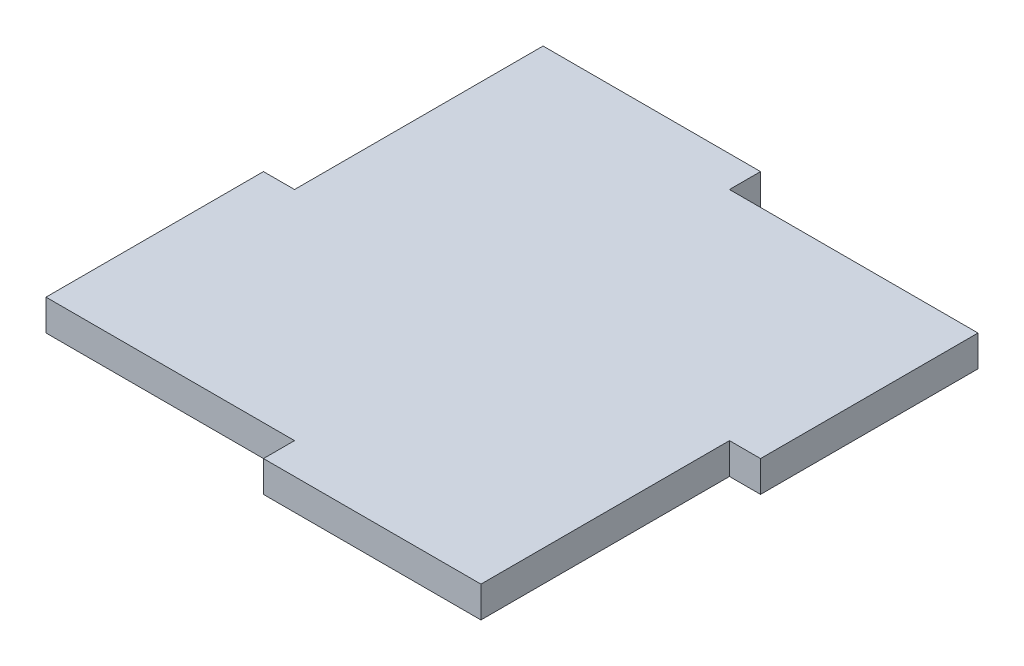
ISO-10303-21;
HEADER;
FILE_DESCRIPTION(('STEP AP214'),'2;1');
FILE_NAME('part.step','',(''),(''),'','','');
FILE_SCHEMA(('AUTOMOTIVE_DESIGN { 1 0 10303 214 1 1 1 1 }'));
ENDSEC;
DATA;
#1=APPLICATION_CONTEXT('core data for automotive mechanical design processes');
#2=APPLICATION_PROTOCOL_DEFINITION('international standard','automotive_design',2000,#1);
#3=PRODUCT_CONTEXT('',#1,'mechanical');
#4=PRODUCT('Part','Part','',(#3));
#5=PRODUCT_RELATED_PRODUCT_CATEGORY('part','',(#4));
#6=PRODUCT_DEFINITION_FORMATION('','',#4);
#7=PRODUCT_DEFINITION_CONTEXT('part definition',#1,'design');
#8=PRODUCT_DEFINITION('design','',#6,#7);
#9=PRODUCT_DEFINITION_SHAPE('','',#8);
#10=(LENGTH_UNIT() NAMED_UNIT(*) SI_UNIT(.MILLI.,.METRE.));
#11=(NAMED_UNIT(*) PLANE_ANGLE_UNIT() SI_UNIT($,.RADIAN.));
#12=(NAMED_UNIT(*) SI_UNIT($,.STERADIAN.) SOLID_ANGLE_UNIT());
#13=UNCERTAINTY_MEASURE_WITH_UNIT(LENGTH_MEASURE(1.E-05),#10,'distance_accuracy_value','');
#14=(GEOMETRIC_REPRESENTATION_CONTEXT(3) GLOBAL_UNCERTAINTY_ASSIGNED_CONTEXT((#13)) GLOBAL_UNIT_ASSIGNED_CONTEXT((#10,
#11,#12)) REPRESENTATION_CONTEXT('',''));
#15=CARTESIAN_POINT('',(0.,0.,0.));
#16=DIRECTION('',(0.,0.,1.));
#17=DIRECTION('',(1.,0.,0.));
#18=AXIS2_PLACEMENT_3D('',#15,#16,#17);
#19=CARTESIAN_POINT('',(0.,12.7,-4.41271186440678));
#20=DIRECTION('',(0.,0.,-1.));
#21=DIRECTION('',(-1.,0.,0.));
#22=AXIS2_PLACEMENT_3D('',#19,#20,#21);
#23=PLANE('',#22);
#24=DIRECTION('',(1.,0.,0.));
#25=VECTOR('',#24,1.);
#26=CARTESIAN_POINT('',(0.,0.,-4.41271186440678));
#27=LINE('',#26,#25);
#28=CARTESIAN_POINT('',(-125.206214689266,0.,-4.41271186440677));
#29=VERTEX_POINT('',#28);
#30=CARTESIAN_POINT('',(-112.506214689266,0.,-4.41271186440677));
#31=VERTEX_POINT('',#30);
#32=EDGE_CURVE('E154',#29,#31,#27,.T.);
#33=ORIENTED_EDGE('',*,*,#32,.F.);
#34=DIRECTION('',(0.,-1.,0.));
#35=VECTOR('',#34,1.);
#36=CARTESIAN_POINT('',(-125.206214689266,12.7,-4.41271186440677));
#37=LINE('',#36,#35);
#38=CARTESIAN_POINT('',(-125.206214689266,12.7,-4.41271186440677));
#39=VERTEX_POINT('',#38);
#40=EDGE_CURVE('E11',#39,#29,#37,.T.);
#41=ORIENTED_EDGE('',*,*,#40,.F.);
#42=DIRECTION('',(1.,0.,0.));
#43=VECTOR('',#42,1.);
#44=CARTESIAN_POINT('',(0.,12.7,-4.41271186440678));
#45=LINE('',#44,#43);
#46=CARTESIAN_POINT('',(-112.506214689266,12.7,-4.41271186440677));
#47=VERTEX_POINT('',#46);
#48=EDGE_CURVE('E186',#39,#47,#45,.T.);
#49=ORIENTED_EDGE('',*,*,#48,.T.);
#50=DIRECTION('',(0.,-1.,0.));
#51=VECTOR('',#50,1.);
#52=CARTESIAN_POINT('',(-112.506214689266,12.7,-4.41271186440677));
#53=LINE('',#52,#51);
#54=EDGE_CURVE('E99',#47,#31,#53,.T.);
#55=ORIENTED_EDGE('',*,*,#54,.T.);
#56=EDGE_LOOP('',(#33,#41,#49,#55));
#57=FACE_BOUND('',#56,.T.);
#58=ADVANCED_FACE('F37',(#57),#23,.T.);
#59=CARTESIAN_POINT('',(-125.206214689266,12.7,0.));
#60=DIRECTION('',(-1.,0.,0.));
#61=DIRECTION('',(0.,0.,1.));
#62=AXIS2_PLACEMENT_3D('',#59,#60,#61);
#63=PLANE('',#62);
#64=DIRECTION('',(0.,0.,-1.));
#65=VECTOR('',#64,1.);
#66=CARTESIAN_POINT('',(-125.206214689266,0.,0.));
#67=LINE('',#66,#65);
#68=CARTESIAN_POINT('',(-125.206214689266,0.,84.4872881355932));
#69=VERTEX_POINT('',#68);
#70=EDGE_CURVE('E157',#69,#29,#67,.T.);
#71=ORIENTED_EDGE('',*,*,#70,.F.);
#72=DIRECTION('',(0.,-1.,0.));
#73=VECTOR('',#72,1.);
#74=CARTESIAN_POINT('',(-125.206214689266,12.7,84.4872881355932));
#75=LINE('',#74,#73);
#76=CARTESIAN_POINT('',(-125.206214689266,12.7,84.4872881355932));
#77=VERTEX_POINT('',#76);
#78=EDGE_CURVE('E45',#77,#69,#75,.T.);
#79=ORIENTED_EDGE('',*,*,#78,.F.);
#80=DIRECTION('',(0.,0.,-1.));
#81=VECTOR('',#80,1.);
#82=CARTESIAN_POINT('',(-125.206214689266,12.7,0.));
#83=LINE('',#82,#81);
#84=EDGE_CURVE('E223',#77,#39,#83,.T.);
#85=ORIENTED_EDGE('',*,*,#84,.T.);
#86=ORIENTED_EDGE('',*,*,#40,.T.);
#87=EDGE_LOOP('',(#71,#79,#85,#86));
#88=FACE_BOUND('',#87,.T.);
#89=ADVANCED_FACE('F211',(#88),#63,.T.);
#90=CARTESIAN_POINT('',(0.,12.7,84.4872881355932));
#91=DIRECTION('',(0.,0.,1.));
#92=DIRECTION('',(1.,0.,0.));
#93=AXIS2_PLACEMENT_3D('',#90,#91,#92);
#94=PLANE('',#93);
#95=DIRECTION('',(-1.,0.,0.));
#96=VECTOR('',#95,1.);
#97=CARTESIAN_POINT('',(0.,0.,84.4872881355932));
#98=LINE('',#97,#96);
#99=CARTESIAN_POINT('',(-23.6062146892655,0.,84.4872881355932));
#100=VERTEX_POINT('',#99);
#101=EDGE_CURVE('E160',#100,#69,#98,.T.);
#102=ORIENTED_EDGE('',*,*,#101,.F.);
#103=DIRECTION('',(0.,-1.,0.));
#104=VECTOR('',#103,1.);
#105=CARTESIAN_POINT('',(-23.6062146892655,12.7,84.4872881355932));
#106=LINE('',#105,#104);
#107=CARTESIAN_POINT('',(-23.6062146892655,12.7,84.4872881355932));
#108=VERTEX_POINT('',#107);
#109=EDGE_CURVE('E200',#108,#100,#106,.T.);
#110=ORIENTED_EDGE('',*,*,#109,.F.);
#111=DIRECTION('',(-1.,0.,0.));
#112=VECTOR('',#111,1.);
#113=CARTESIAN_POINT('',(0.,12.7,84.4872881355932));
#114=LINE('',#113,#112);
#115=EDGE_CURVE('E207',#108,#77,#114,.T.);
#116=ORIENTED_EDGE('',*,*,#115,.T.);
#117=ORIENTED_EDGE('',*,*,#78,.T.);
#118=EDGE_LOOP('',(#102,#110,#116,#117));
#119=FACE_BOUND('',#118,.T.);
#120=ADVANCED_FACE('F205',(#119),#94,.T.);
#121=CARTESIAN_POINT('',(-23.6062146892654,12.7,0.));
#122=DIRECTION('',(-1.,0.,0.));
#123=DIRECTION('',(0.,0.,1.));
#124=AXIS2_PLACEMENT_3D('',#121,#122,#123);
#125=PLANE('',#124);
#126=DIRECTION('',(0.,0.,-1.));
#127=VECTOR('',#126,1.);
#128=CARTESIAN_POINT('',(-23.6062146892654,0.,0.));
#129=LINE('',#128,#127);
#130=CARTESIAN_POINT('',(-23.6062146892655,0.,97.1872881355932));
#131=VERTEX_POINT('',#130);
#132=EDGE_CURVE('E163',#131,#100,#129,.T.);
#133=ORIENTED_EDGE('',*,*,#132,.F.);
#134=DIRECTION('',(0.,-1.,0.));
#135=VECTOR('',#134,1.);
#136=CARTESIAN_POINT('',(-23.6062146892655,12.7,97.1872881355932));
#137=LINE('',#136,#135);
#138=CARTESIAN_POINT('',(-23.6062146892655,12.7,97.1872881355932));
#139=VERTEX_POINT('',#138);
#140=EDGE_CURVE('E198',#139,#131,#137,.T.);
#141=ORIENTED_EDGE('',*,*,#140,.F.);
#142=DIRECTION('',(0.,0.,-1.));
#143=VECTOR('',#142,1.);
#144=CARTESIAN_POINT('',(-23.6062146892654,12.7,0.));
#145=LINE('',#144,#143);
#146=EDGE_CURVE('E220',#139,#108,#145,.T.);
#147=ORIENTED_EDGE('',*,*,#146,.T.);
#148=ORIENTED_EDGE('',*,*,#109,.T.);
#149=EDGE_LOOP('',(#133,#141,#147,#148));
#150=FACE_BOUND('',#149,.T.);
#151=ADVANCED_FACE('F217',(#150),#125,.T.);
#152=CARTESIAN_POINT('',(0.,12.7,97.1872881355932));
#153=DIRECTION('',(0.,0.,1.));
#154=DIRECTION('',(1.,0.,0.));
#155=AXIS2_PLACEMENT_3D('',#152,#153,#154);
#156=PLANE('',#155);
#157=DIRECTION('',(-1.,0.,0.));
#158=VECTOR('',#157,1.);
#159=CARTESIAN_POINT('',(0.,0.,97.1872881355932));
#160=LINE('',#159,#158);
#161=CARTESIAN_POINT('',(65.2937853107345,0.,97.1872881355932));
#162=VERTEX_POINT('',#161);
#163=EDGE_CURVE('E166',#162,#131,#160,.T.);
#164=ORIENTED_EDGE('',*,*,#163,.F.);
#165=DIRECTION('',(0.,-1.,0.));
#166=VECTOR('',#165,1.);
#167=CARTESIAN_POINT('',(65.2937853107345,12.7,97.1872881355932));
#168=LINE('',#167,#166);
#169=CARTESIAN_POINT('',(65.2937853107345,12.7,97.1872881355932));
#170=VERTEX_POINT('',#169);
#171=EDGE_CURVE('E196',#170,#162,#168,.T.);
#172=ORIENTED_EDGE('',*,*,#171,.F.);
#173=DIRECTION('',(-1.,0.,0.));
#174=VECTOR('',#173,1.);
#175=CARTESIAN_POINT('',(0.,12.7,97.1872881355932));
#176=LINE('',#175,#174);
#177=EDGE_CURVE('E225',#170,#139,#176,.T.);
#178=ORIENTED_EDGE('',*,*,#177,.T.);
#179=ORIENTED_EDGE('',*,*,#140,.T.);
#180=EDGE_LOOP('',(#164,#172,#178,#179));
#181=FACE_BOUND('',#180,.T.);
#182=ADVANCED_FACE('F255',(#181),#156,.T.);
#183=CARTESIAN_POINT('',(65.2937853107345,12.7,0.));
#184=DIRECTION('',(1.,0.,0.));
#185=DIRECTION('',(0.,0.,-1.));
#186=AXIS2_PLACEMENT_3D('',#183,#184,#185);
#187=PLANE('',#186);
#188=DIRECTION('',(0.,0.,1.));
#189=VECTOR('',#188,1.);
#190=CARTESIAN_POINT('',(65.2937853107345,0.,0.));
#191=LINE('',#190,#189);
#192=CARTESIAN_POINT('',(65.2937853107345,0.,-4.41271186440677));
#193=VERTEX_POINT('',#192);
#194=EDGE_CURVE('E169',#193,#162,#191,.T.);
#195=ORIENTED_EDGE('',*,*,#194,.F.);
#196=DIRECTION('',(0.,-1.,0.));
#197=VECTOR('',#196,1.);
#198=CARTESIAN_POINT('',(65.2937853107345,12.7,-4.41271186440677));
#199=LINE('',#198,#197);
#200=CARTESIAN_POINT('',(65.2937853107345,12.7,-4.41271186440677));
#201=VERTEX_POINT('',#200);
#202=EDGE_CURVE('E194',#201,#193,#199,.T.);
#203=ORIENTED_EDGE('',*,*,#202,.F.);
#204=DIRECTION('',(0.,0.,1.));
#205=VECTOR('',#204,1.);
#206=CARTESIAN_POINT('',(65.2937853107345,12.7,0.));
#207=LINE('',#206,#205);
#208=EDGE_CURVE('E231',#201,#170,#207,.T.);
#209=ORIENTED_EDGE('',*,*,#208,.T.);
#210=ORIENTED_EDGE('',*,*,#171,.T.);
#211=EDGE_LOOP('',(#195,#203,#209,#210));
#212=FACE_BOUND('',#211,.T.);
#213=ADVANCED_FACE('F258',(#212),#187,.T.);
#214=CARTESIAN_POINT('',(0.,12.7,-4.41271186440676));
#215=DIRECTION('',(0.,0.,1.));
#216=DIRECTION('',(1.,0.,0.));
#217=AXIS2_PLACEMENT_3D('',#214,#215,#216);
#218=PLANE('',#217);
#219=DIRECTION('',(-1.,0.,0.));
#220=VECTOR('',#219,1.);
#221=CARTESIAN_POINT('',(0.,0.,-4.41271186440676));
#222=LINE('',#221,#220);
#223=CARTESIAN_POINT('',(77.9937853107345,0.,-4.41271186440677));
#224=VERTEX_POINT('',#223);
#225=EDGE_CURVE('E172',#224,#193,#222,.T.);
#226=ORIENTED_EDGE('',*,*,#225,.F.);
#227=DIRECTION('',(0.,-1.,0.));
#228=VECTOR('',#227,1.);
#229=CARTESIAN_POINT('',(77.9937853107345,12.7,-4.41271186440677));
#230=LINE('',#229,#228);
#231=CARTESIAN_POINT('',(77.9937853107345,12.7,-4.41271186440677));
#232=VERTEX_POINT('',#231);
#233=EDGE_CURVE('E192',#232,#224,#230,.T.);
#234=ORIENTED_EDGE('',*,*,#233,.F.);
#235=DIRECTION('',(-1.,0.,0.));
#236=VECTOR('',#235,1.);
#237=CARTESIAN_POINT('',(0.,12.7,-4.41271186440676));
#238=LINE('',#237,#236);
#239=EDGE_CURVE('E234',#232,#201,#238,.T.);
#240=ORIENTED_EDGE('',*,*,#239,.T.);
#241=ORIENTED_EDGE('',*,*,#202,.T.);
#242=EDGE_LOOP('',(#226,#234,#240,#241));
#243=FACE_BOUND('',#242,.T.);
#244=ADVANCED_FACE('F262',(#243),#218,.T.);
#245=CARTESIAN_POINT('',(77.9937853107345,12.7,0.));
#246=DIRECTION('',(1.,0.,0.));
#247=DIRECTION('',(0.,0.,-1.));
#248=AXIS2_PLACEMENT_3D('',#245,#246,#247);
#249=PLANE('',#248);
#250=DIRECTION('',(0.,0.,1.));
#251=VECTOR('',#250,1.);
#252=CARTESIAN_POINT('',(77.9937853107345,0.,0.));
#253=LINE('',#252,#251);
#254=CARTESIAN_POINT('',(77.9937853107345,0.,-93.3127118644068));
#255=VERTEX_POINT('',#254);
#256=EDGE_CURVE('E175',#255,#224,#253,.T.);
#257=ORIENTED_EDGE('',*,*,#256,.F.);
#258=DIRECTION('',(0.,-1.,0.));
#259=VECTOR('',#258,1.);
#260=CARTESIAN_POINT('',(77.9937853107345,12.7,-93.3127118644068));
#261=LINE('',#260,#259);
#262=CARTESIAN_POINT('',(77.9937853107345,12.7,-93.3127118644068));
#263=VERTEX_POINT('',#262);
#264=EDGE_CURVE('E190',#263,#255,#261,.T.);
#265=ORIENTED_EDGE('',*,*,#264,.F.);
#266=DIRECTION('',(0.,0.,1.));
#267=VECTOR('',#266,1.);
#268=CARTESIAN_POINT('',(77.9937853107345,12.7,0.));
#269=LINE('',#268,#267);
#270=EDGE_CURVE('E237',#263,#232,#269,.T.);
#271=ORIENTED_EDGE('',*,*,#270,.T.);
#272=ORIENTED_EDGE('',*,*,#233,.T.);
#273=EDGE_LOOP('',(#257,#265,#271,#272));
#274=FACE_BOUND('',#273,.T.);
#275=ADVANCED_FACE('F266',(#274),#249,.T.);
#276=CARTESIAN_POINT('',(0.,12.7,-93.3127118644068));
#277=DIRECTION('',(0.,0.,-1.));
#278=DIRECTION('',(-1.,0.,0.));
#279=AXIS2_PLACEMENT_3D('',#276,#277,#278);
#280=PLANE('',#279);
#281=DIRECTION('',(1.,0.,0.));
#282=VECTOR('',#281,1.);
#283=CARTESIAN_POINT('',(0.,0.,-93.3127118644068));
#284=LINE('',#283,#282);
#285=CARTESIAN_POINT('',(-23.6062146892655,0.,-93.3127118644068));
#286=VERTEX_POINT('',#285);
#287=EDGE_CURVE('E178',#286,#255,#284,.T.);
#288=ORIENTED_EDGE('',*,*,#287,.F.);
#289=DIRECTION('',(0.,-1.,0.));
#290=VECTOR('',#289,1.);
#291=CARTESIAN_POINT('',(-23.6062146892655,12.7,-93.3127118644068));
#292=LINE('',#291,#290);
#293=CARTESIAN_POINT('',(-23.6062146892655,12.7,-93.3127118644068));
#294=VERTEX_POINT('',#293);
#295=EDGE_CURVE('E140',#294,#286,#292,.T.);
#296=ORIENTED_EDGE('',*,*,#295,.F.);
#297=DIRECTION('',(1.,0.,0.));
#298=VECTOR('',#297,1.);
#299=CARTESIAN_POINT('',(0.,12.7,-93.3127118644068));
#300=LINE('',#299,#298);
#301=EDGE_CURVE('E147',#294,#263,#300,.T.);
#302=ORIENTED_EDGE('',*,*,#301,.T.);
#303=ORIENTED_EDGE('',*,*,#264,.T.);
#304=EDGE_LOOP('',(#288,#296,#302,#303));
#305=FACE_BOUND('',#304,.T.);
#306=ADVANCED_FACE('F241',(#305),#280,.T.);
#307=CARTESIAN_POINT('',(-23.6062146892655,12.7,0.));
#308=DIRECTION('',(1.,0.,0.));
#309=DIRECTION('',(0.,0.,-1.));
#310=AXIS2_PLACEMENT_3D('',#307,#308,#309);
#311=PLANE('',#310);
#312=DIRECTION('',(0.,0.,1.));
#313=VECTOR('',#312,1.);
#314=CARTESIAN_POINT('',(-23.6062146892655,0.,0.));
#315=LINE('',#314,#313);
#316=CARTESIAN_POINT('',(-23.6062146892655,0.,-106.012711864407));
#317=VERTEX_POINT('',#316);
#318=EDGE_CURVE('E135',#317,#286,#315,.T.);
#319=ORIENTED_EDGE('',*,*,#318,.F.);
#320=DIRECTION('',(0.,-1.,0.));
#321=VECTOR('',#320,1.);
#322=CARTESIAN_POINT('',(-23.6062146892655,12.7,-106.012711864407));
#323=LINE('',#322,#321);
#324=CARTESIAN_POINT('',(-23.6062146892655,12.7,-106.012711864407));
#325=VERTEX_POINT('',#324);
#326=EDGE_CURVE('E130',#325,#317,#323,.T.);
#327=ORIENTED_EDGE('',*,*,#326,.F.);
#328=DIRECTION('',(0.,0.,1.));
#329=VECTOR('',#328,1.);
#330=CARTESIAN_POINT('',(-23.6062146892655,12.7,0.));
#331=LINE('',#330,#329);
#332=EDGE_CURVE('E133',#325,#294,#331,.T.);
#333=ORIENTED_EDGE('',*,*,#332,.T.);
#334=ORIENTED_EDGE('',*,*,#295,.T.);
#335=EDGE_LOOP('',(#319,#327,#333,#334));
#336=FACE_BOUND('',#335,.T.);
#337=ADVANCED_FACE('F132',(#336),#311,.T.);
#338=CARTESIAN_POINT('',(0.,12.7,-106.012711864407));
#339=DIRECTION('',(0.,0.,-1.));
#340=DIRECTION('',(-1.,0.,0.));
#341=AXIS2_PLACEMENT_3D('',#338,#339,#340);
#342=PLANE('',#341);
#343=DIRECTION('',(1.,0.,0.));
#344=VECTOR('',#343,1.);
#345=CARTESIAN_POINT('',(0.,0.,-106.012711864407));
#346=LINE('',#345,#344);
#347=CARTESIAN_POINT('',(-112.506214689266,0.,-106.012711864407));
#348=VERTEX_POINT('',#347);
#349=EDGE_CURVE('E182',#348,#317,#346,.T.);
#350=ORIENTED_EDGE('',*,*,#349,.F.);
#351=DIRECTION('',(0.,-1.,0.));
#352=VECTOR('',#351,1.);
#353=CARTESIAN_POINT('',(-112.506214689266,12.7,-106.012711864407));
#354=LINE('',#353,#352);
#355=CARTESIAN_POINT('',(-112.506214689266,12.7,-106.012711864407));
#356=VERTEX_POINT('',#355);
#357=EDGE_CURVE('E92',#356,#348,#354,.T.);
#358=ORIENTED_EDGE('',*,*,#357,.F.);
#359=DIRECTION('',(1.,0.,0.));
#360=VECTOR('',#359,1.);
#361=CARTESIAN_POINT('',(0.,12.7,-106.012711864407));
#362=LINE('',#361,#360);
#363=EDGE_CURVE('E144',#356,#325,#362,.T.);
#364=ORIENTED_EDGE('',*,*,#363,.T.);
#365=ORIENTED_EDGE('',*,*,#326,.T.);
#366=EDGE_LOOP('',(#350,#358,#364,#365));
#367=FACE_BOUND('',#366,.T.);
#368=ADVANCED_FACE('F149',(#367),#342,.T.);
#369=CARTESIAN_POINT('',(-112.506214689266,12.7,0.));
#370=DIRECTION('',(1.,0.,0.));
#371=DIRECTION('',(0.,0.,-1.));
#372=AXIS2_PLACEMENT_3D('',#369,#370,#371);
#373=PLANE('',#372);
#374=DIRECTION('',(0.,0.,1.));
#375=VECTOR('',#374,1.);
#376=CARTESIAN_POINT('',(-112.506214689266,0.,0.));
#377=LINE('',#376,#375);
#378=EDGE_CURVE('E184',#348,#31,#377,.T.);
#379=ORIENTED_EDGE('',*,*,#378,.T.);
#380=ORIENTED_EDGE('',*,*,#54,.F.);
#381=DIRECTION('',(0.,0.,1.));
#382=VECTOR('',#381,1.);
#383=CARTESIAN_POINT('',(-112.506214689266,12.7,0.));
#384=LINE('',#383,#382);
#385=EDGE_CURVE('E53',#356,#47,#384,.T.);
#386=ORIENTED_EDGE('',*,*,#385,.F.);
#387=ORIENTED_EDGE('',*,*,#357,.T.);
#388=EDGE_LOOP('',(#379,#380,#386,#387));
#389=FACE_BOUND('',#388,.T.);
#390=ADVANCED_FACE('F243',(#389),#373,.F.);
#391=CARTESIAN_POINT('',(0.,12.7,0.));
#392=DIRECTION('',(0.,1.,0.));
#393=DIRECTION('',(0.,0.,1.));
#394=AXIS2_PLACEMENT_3D('',#391,#392,#393);
#395=PLANE('',#394);
#396=ORIENTED_EDGE('',*,*,#48,.F.);
#397=ORIENTED_EDGE('',*,*,#84,.F.);
#398=ORIENTED_EDGE('',*,*,#115,.F.);
#399=ORIENTED_EDGE('',*,*,#146,.F.);
#400=ORIENTED_EDGE('',*,*,#177,.F.);
#401=ORIENTED_EDGE('',*,*,#208,.F.);
#402=ORIENTED_EDGE('',*,*,#239,.F.);
#403=ORIENTED_EDGE('',*,*,#270,.F.);
#404=ORIENTED_EDGE('',*,*,#301,.F.);
#405=ORIENTED_EDGE('',*,*,#332,.F.);
#406=ORIENTED_EDGE('',*,*,#363,.F.);
#407=ORIENTED_EDGE('',*,*,#385,.T.);
#408=EDGE_LOOP('',(#396,#397,#398,#399,#400,#401,#402,#403,#404,#405,#406,#407));
#409=FACE_BOUND('',#408,.T.);
#410=ADVANCED_FACE('F143',(#409),#395,.T.);
#411=CARTESIAN_POINT('',(0.,0.,0.));
#412=DIRECTION('',(0.,1.,0.));
#413=DIRECTION('',(0.,0.,1.));
#414=AXIS2_PLACEMENT_3D('',#411,#412,#413);
#415=PLANE('',#414);
#416=ORIENTED_EDGE('',*,*,#32,.T.);
#417=ORIENTED_EDGE('',*,*,#378,.F.);
#418=ORIENTED_EDGE('',*,*,#349,.T.);
#419=ORIENTED_EDGE('',*,*,#318,.T.);
#420=ORIENTED_EDGE('',*,*,#287,.T.);
#421=ORIENTED_EDGE('',*,*,#256,.T.);
#422=ORIENTED_EDGE('',*,*,#225,.T.);
#423=ORIENTED_EDGE('',*,*,#194,.T.);
#424=ORIENTED_EDGE('',*,*,#163,.T.);
#425=ORIENTED_EDGE('',*,*,#132,.T.);
#426=ORIENTED_EDGE('',*,*,#101,.T.);
#427=ORIENTED_EDGE('',*,*,#70,.T.);
#428=EDGE_LOOP('',(#416,#417,#418,#419,#420,#421,#422,#423,#424,#425,#426,#427));
#429=FACE_BOUND('',#428,.T.);
#430=ADVANCED_FACE('F213',(#429),#415,.F.);
#431=CLOSED_SHELL('',(#58,#89,#120,#151,#182,#213,#244,#275,#306,#337,#368,#390,#410,#430));
#432=MANIFOLD_SOLID_BREP('B2',#431);
#433=ADVANCED_BREP_SHAPE_REPRESENTATION('',(#18,#432),#14);
#434=SHAPE_DEFINITION_REPRESENTATION(#9,#433);
ENDSEC;
END-ISO-10303-21;
